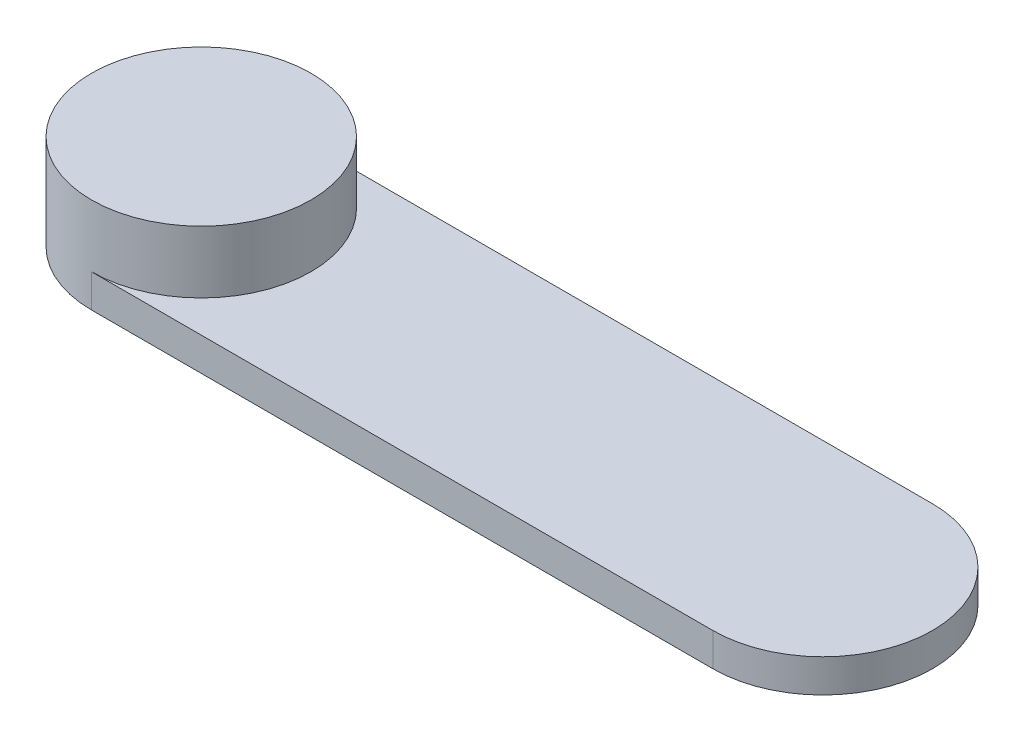
ISO-10303-21;
HEADER;
FILE_DESCRIPTION(('STEP AP214'),'2;1');
FILE_NAME('part.step','',(''),(''),'','','');
FILE_SCHEMA(('AUTOMOTIVE_DESIGN { 1 0 10303 214 1 1 1 1 }'));
ENDSEC;
DATA;
#1=APPLICATION_CONTEXT('core data for automotive mechanical design processes');
#2=APPLICATION_PROTOCOL_DEFINITION('international standard','automotive_design',2000,#1);
#3=PRODUCT_CONTEXT('',#1,'mechanical');
#4=PRODUCT('Part','Part','',(#3));
#5=PRODUCT_RELATED_PRODUCT_CATEGORY('part','',(#4));
#6=PRODUCT_DEFINITION_FORMATION('','',#4);
#7=PRODUCT_DEFINITION_CONTEXT('part definition',#1,'design');
#8=PRODUCT_DEFINITION('design','',#6,#7);
#9=PRODUCT_DEFINITION_SHAPE('','',#8);
#10=(LENGTH_UNIT() NAMED_UNIT(*) SI_UNIT(.MILLI.,.METRE.));
#11=(NAMED_UNIT(*) PLANE_ANGLE_UNIT() SI_UNIT($,.RADIAN.));
#12=(NAMED_UNIT(*) SI_UNIT($,.STERADIAN.) SOLID_ANGLE_UNIT());
#13=UNCERTAINTY_MEASURE_WITH_UNIT(LENGTH_MEASURE(1.E-05),#10,'distance_accuracy_value','');
#14=(GEOMETRIC_REPRESENTATION_CONTEXT(3) GLOBAL_UNCERTAINTY_ASSIGNED_CONTEXT((#13)) GLOBAL_UNIT_ASSIGNED_CONTEXT((#10,
#11,#12)) REPRESENTATION_CONTEXT('',''));
#15=CARTESIAN_POINT('',(0.,0.,0.));
#16=DIRECTION('',(0.,0.,1.));
#17=DIRECTION('',(1.,0.,0.));
#18=AXIS2_PLACEMENT_3D('',#15,#16,#17);
#19=CARTESIAN_POINT('',(75.,8.,0.));
#20=DIRECTION('',(0.,-1.,0.));
#21=DIRECTION('',(0.,0.,-1.));
#22=AXIS2_PLACEMENT_3D('',#19,#20,#21);
#23=CYLINDRICAL_SURFACE('',#22,26.5);
#24=CARTESIAN_POINT('',(75.,0.,0.));
#25=DIRECTION('',(0.,1.,0.));
#26=DIRECTION('',(0.,0.,1.));
#27=AXIS2_PLACEMENT_3D('',#24,#25,#26);
#28=CIRCLE('',#27,26.5);
#29=CARTESIAN_POINT('',(75.,0.,26.5));
#30=VERTEX_POINT('',#29);
#31=CARTESIAN_POINT('',(75.,0.,-26.5));
#32=VERTEX_POINT('',#31);
#33=EDGE_CURVE('E97',#30,#32,#28,.T.);
#34=ORIENTED_EDGE('',*,*,#33,.T.);
#35=DIRECTION('',(0.,-1.,0.));
#36=VECTOR('',#35,1.);
#37=CARTESIAN_POINT('',(75.,8.,-26.5));
#38=LINE('',#37,#36);
#39=CARTESIAN_POINT('',(75.,8.,-26.5));
#40=VERTEX_POINT('',#39);
#41=EDGE_CURVE('E11',#40,#32,#38,.T.);
#42=ORIENTED_EDGE('',*,*,#41,.F.);
#43=CARTESIAN_POINT('',(75.,8.,0.));
#44=DIRECTION('',(0.,1.,0.));
#45=DIRECTION('',(0.,0.,1.));
#46=AXIS2_PLACEMENT_3D('',#43,#44,#45);
#47=CIRCLE('',#46,26.5);
#48=CARTESIAN_POINT('',(75.,8.,26.5));
#49=VERTEX_POINT('',#48);
#50=EDGE_CURVE('E100',#49,#40,#47,.T.);
#51=ORIENTED_EDGE('',*,*,#50,.F.);
#52=DIRECTION('',(0.,-1.,0.));
#53=VECTOR('',#52,1.);
#54=CARTESIAN_POINT('',(75.,8.,26.5));
#55=LINE('',#54,#53);
#56=EDGE_CURVE('E85',#49,#30,#55,.T.);
#57=ORIENTED_EDGE('',*,*,#56,.T.);
#58=EDGE_LOOP('',(#34,#42,#51,#57));
#59=FACE_BOUND('',#58,.T.);
#60=ADVANCED_FACE('F36',(#59),#23,.T.);
#61=CARTESIAN_POINT('',(75.,8.,-26.5));
#62=DIRECTION('',(0.,0.,1.));
#63=DIRECTION('',(1.,0.,0.));
#64=AXIS2_PLACEMENT_3D('',#61,#62,#63);
#65=PLANE('',#64);
#66=DIRECTION('',(-1.,0.,0.));
#67=VECTOR('',#66,1.);
#68=CARTESIAN_POINT('',(75.,0.,-26.5));
#69=LINE('',#68,#67);
#70=CARTESIAN_POINT('',(-75.,0.,-26.5));
#71=VERTEX_POINT('',#70);
#72=EDGE_CURVE('E105',#32,#71,#69,.T.);
#73=ORIENTED_EDGE('',*,*,#72,.T.);
#74=DIRECTION('',(0.,-1.,0.));
#75=VECTOR('',#74,1.);
#76=CARTESIAN_POINT('',(-75.,8.,-26.5));
#77=LINE('',#76,#75);
#78=CARTESIAN_POINT('',(-75.,8.,-26.5));
#79=VERTEX_POINT('',#78);
#80=EDGE_CURVE('E44',#79,#71,#77,.T.);
#81=ORIENTED_EDGE('',*,*,#80,.F.);
#82=DIRECTION('',(-1.,0.,0.));
#83=VECTOR('',#82,1.);
#84=CARTESIAN_POINT('',(75.,8.,-26.5));
#85=LINE('',#84,#83);
#86=EDGE_CURVE('E81',#40,#79,#85,.T.);
#87=ORIENTED_EDGE('',*,*,#86,.F.);
#88=ORIENTED_EDGE('',*,*,#41,.T.);
#89=EDGE_LOOP('',(#73,#81,#87,#88));
#90=FACE_BOUND('',#89,.T.);
#91=ADVANCED_FACE('F114',(#90),#65,.F.);
#92=CARTESIAN_POINT('',(-75.,8.,0.));
#93=DIRECTION('',(0.,-1.,0.));
#94=DIRECTION('',(0.,0.,-1.));
#95=AXIS2_PLACEMENT_3D('',#92,#93,#94);
#96=CYLINDRICAL_SURFACE('',#95,26.5);
#97=CARTESIAN_POINT('',(-75.,0.,0.));
#98=DIRECTION('',(0.,1.,0.));
#99=DIRECTION('',(0.,0.,1.));
#100=AXIS2_PLACEMENT_3D('',#97,#98,#99);
#101=CIRCLE('',#100,26.5);
#102=CARTESIAN_POINT('',(-75.,0.,26.5));
#103=VERTEX_POINT('',#102);
#104=EDGE_CURVE('E71',#71,#103,#101,.T.);
#105=ORIENTED_EDGE('',*,*,#104,.T.);
#106=DIRECTION('',(0.,-1.,0.));
#107=VECTOR('',#106,1.);
#108=CARTESIAN_POINT('',(-75.,8.,26.5));
#109=LINE('',#108,#107);
#110=CARTESIAN_POINT('',(-75.,8.,26.5));
#111=VERTEX_POINT('',#110);
#112=EDGE_CURVE('E84',#111,#103,#109,.T.);
#113=ORIENTED_EDGE('',*,*,#112,.F.);
#114=CARTESIAN_POINT('',(-75.,8.,0.));
#115=DIRECTION('',(0.,1.,0.));
#116=DIRECTION('',(0.,0.,1.));
#117=AXIS2_PLACEMENT_3D('',#114,#115,#116);
#118=CIRCLE('',#117,26.5);
#119=EDGE_CURVE('E91',#111,#79,#118,.T.);
#120=ORIENTED_EDGE('',*,*,#119,.T.);
#121=ORIENTED_EDGE('',*,*,#80,.T.);
#122=EDGE_LOOP('',(#105,#113,#120,#121));
#123=FACE_BOUND('',#122,.T.);
#124=CARTESIAN_POINT('',(-75.,23.,0.));
#125=DIRECTION('',(0.,1.,0.));
#126=DIRECTION('',(0.,0.,1.));
#127=AXIS2_PLACEMENT_3D('',#124,#125,#126);
#128=CIRCLE('',#127,26.5);
#129=CARTESIAN_POINT('',(-75.,23.,26.5));
#130=VERTEX_POINT('',#129);
#131=EDGE_CURVE('E94',#130,#130,#128,.T.);
#132=ORIENTED_EDGE('',*,*,#131,.F.);
#133=EDGE_LOOP('',(#132));
#134=FACE_BOUND('',#133,.T.);
#135=ADVANCED_FACE('F89',(#123,#134),#96,.T.);
#136=CARTESIAN_POINT('',(75.,8.,26.5));
#137=DIRECTION('',(0.,0.,-1.));
#138=DIRECTION('',(-1.,0.,0.));
#139=AXIS2_PLACEMENT_3D('',#136,#137,#138);
#140=PLANE('',#139);
#141=DIRECTION('',(1.,0.,0.));
#142=VECTOR('',#141,1.);
#143=CARTESIAN_POINT('',(75.,0.,26.5));
#144=LINE('',#143,#142);
#145=EDGE_CURVE('E76',#103,#30,#144,.T.);
#146=ORIENTED_EDGE('',*,*,#145,.T.);
#147=ORIENTED_EDGE('',*,*,#56,.F.);
#148=DIRECTION('',(1.,0.,0.));
#149=VECTOR('',#148,1.);
#150=CARTESIAN_POINT('',(75.,8.,26.5));
#151=LINE('',#150,#149);
#152=EDGE_CURVE('E52',#111,#49,#151,.T.);
#153=ORIENTED_EDGE('',*,*,#152,.F.);
#154=ORIENTED_EDGE('',*,*,#112,.T.);
#155=EDGE_LOOP('',(#146,#147,#153,#154));
#156=FACE_BOUND('',#155,.T.);
#157=ADVANCED_FACE('F83',(#156),#140,.F.);
#158=CARTESIAN_POINT('',(75.,8.,0.));
#159=DIRECTION('',(0.,1.,0.));
#160=DIRECTION('',(0.,0.,1.));
#161=AXIS2_PLACEMENT_3D('',#158,#159,#160);
#162=PLANE('',#161);
#163=ORIENTED_EDGE('',*,*,#119,.F.);
#164=ORIENTED_EDGE('',*,*,#152,.T.);
#165=ORIENTED_EDGE('',*,*,#50,.T.);
#166=ORIENTED_EDGE('',*,*,#86,.T.);
#167=EDGE_LOOP('',(#163,#164,#165,#166));
#168=FACE_BOUND('',#167,.T.);
#169=ADVANCED_FACE('F93',(#168),#162,.T.);
#170=CARTESIAN_POINT('',(75.,0.,0.));
#171=DIRECTION('',(0.,1.,0.));
#172=DIRECTION('',(0.,0.,1.));
#173=AXIS2_PLACEMENT_3D('',#170,#171,#172);
#174=PLANE('',#173);
#175=ORIENTED_EDGE('',*,*,#33,.F.);
#176=ORIENTED_EDGE('',*,*,#145,.F.);
#177=ORIENTED_EDGE('',*,*,#104,.F.);
#178=ORIENTED_EDGE('',*,*,#72,.F.);
#179=EDGE_LOOP('',(#175,#176,#177,#178));
#180=FACE_BOUND('',#179,.T.);
#181=ADVANCED_FACE('F111',(#180),#174,.F.);
#182=CARTESIAN_POINT('',(-75.,23.,0.));
#183=DIRECTION('',(0.,1.,0.));
#184=DIRECTION('',(0.,0.,1.));
#185=AXIS2_PLACEMENT_3D('',#182,#183,#184);
#186=PLANE('',#185);
#187=ORIENTED_EDGE('',*,*,#131,.T.);
#188=EDGE_LOOP('',(#187));
#189=FACE_BOUND('',#188,.T.);
#190=ADVANCED_FACE('F126',(#189),#186,.T.);
#191=CLOSED_SHELL('',(#60,#91,#135,#157,#169,#181,#190));
#192=MANIFOLD_SOLID_BREP('B2',#191);
#193=ADVANCED_BREP_SHAPE_REPRESENTATION('',(#18,#192),#14);
#194=SHAPE_DEFINITION_REPRESENTATION(#9,#193);
ENDSEC;
END-ISO-10303-21;
